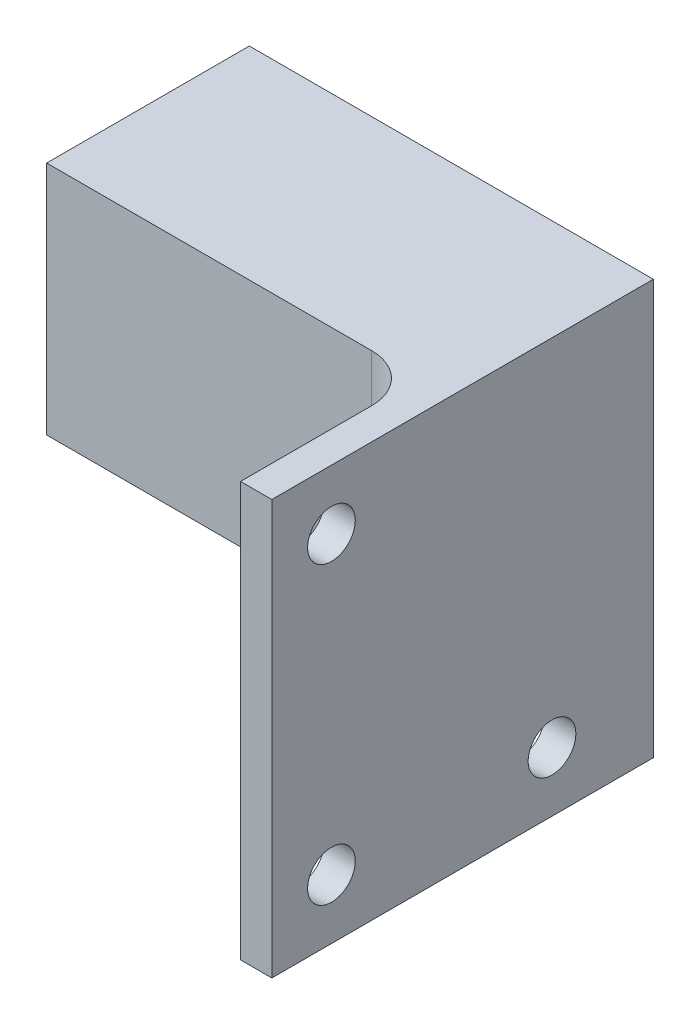
ISO-10303-21;
HEADER;
FILE_DESCRIPTION(('STEP AP214'),'2;1');
FILE_NAME('part.step','',(''),(''),'','','');
FILE_SCHEMA(('AUTOMOTIVE_DESIGN { 1 0 10303 214 1 1 1 1 }'));
ENDSEC;
DATA;
#1=APPLICATION_CONTEXT('core data for automotive mechanical design processes');
#2=APPLICATION_PROTOCOL_DEFINITION('international standard','automotive_design',2000,#1);
#3=PRODUCT_CONTEXT('',#1,'mechanical');
#4=PRODUCT('Part','Part','',(#3));
#5=PRODUCT_RELATED_PRODUCT_CATEGORY('part','',(#4));
#6=PRODUCT_DEFINITION_FORMATION('','',#4);
#7=PRODUCT_DEFINITION_CONTEXT('part definition',#1,'design');
#8=PRODUCT_DEFINITION('design','',#6,#7);
#9=PRODUCT_DEFINITION_SHAPE('','',#8);
#10=(LENGTH_UNIT() NAMED_UNIT(*) SI_UNIT(.MILLI.,.METRE.));
#11=(NAMED_UNIT(*) PLANE_ANGLE_UNIT() SI_UNIT($,.RADIAN.));
#12=(NAMED_UNIT(*) SI_UNIT($,.STERADIAN.) SOLID_ANGLE_UNIT());
#13=UNCERTAINTY_MEASURE_WITH_UNIT(LENGTH_MEASURE(1.E-05),#10,'distance_accuracy_value','');
#14=(GEOMETRIC_REPRESENTATION_CONTEXT(3) GLOBAL_UNCERTAINTY_ASSIGNED_CONTEXT((#13)) GLOBAL_UNIT_ASSIGNED_CONTEXT((#10,
#11,#12)) REPRESENTATION_CONTEXT('',''));
#15=CARTESIAN_POINT('',(0.,0.,0.));
#16=DIRECTION('',(0.,0.,1.));
#17=DIRECTION('',(1.,0.,0.));
#18=AXIS2_PLACEMENT_3D('',#15,#16,#17);
#19=CARTESIAN_POINT('',(0.,0.,0.));
#20=DIRECTION('',(0.,0.,1.));
#21=DIRECTION('',(1.,0.,0.));
#22=AXIS2_PLACEMENT_3D('',#19,#20,#21);
#23=PLANE('',#22);
#24=DIRECTION('',(0.707106781186549,0.707106781186546,0.));
#25=VECTOR('',#24,1.);
#26=CARTESIAN_POINT('',(14.3189123190276,-14.3189123190276,0.));
#27=LINE('',#26,#25);
#28=CARTESIAN_POINT('',(12.8339880785358,-15.8038365595194,0.));
#29=VERTEX_POINT('',#28);
#30=CARTESIAN_POINT('',(14.3189123190276,-14.3189123190276,0.));
#31=VERTEX_POINT('',#30);
#32=EDGE_CURVE('E230',#29,#31,#27,.T.);
#33=ORIENTED_EDGE('',*,*,#32,.T.);
#34=DIRECTION('',(-0.707106781186546,0.707106781186549,0.));
#35=VECTOR('',#34,1.);
#36=CARTESIAN_POINT('',(0.,0.,0.));
#37=LINE('',#36,#35);
#38=CARTESIAN_POINT('',(0.,0.,0.));
#39=VERTEX_POINT('',#38);
#40=EDGE_CURVE('E197',#31,#39,#37,.T.);
#41=ORIENTED_EDGE('',*,*,#40,.T.);
#42=DIRECTION('',(-0.707106781186549,-0.707106781186546,0.));
#43=VECTOR('',#42,1.);
#44=CARTESIAN_POINT('',(-14.3189123190276,-14.3189123190276,0.));
#45=LINE('',#44,#43);
#46=CARTESIAN_POINT('',(-14.3189123190276,-14.3189123190276,0.));
#47=VERTEX_POINT('',#46);
#48=EDGE_CURVE('E192',#39,#47,#45,.T.);
#49=ORIENTED_EDGE('',*,*,#48,.T.);
#50=DIRECTION('',(0.707106781186546,-0.707106781186549,0.));
#51=VECTOR('',#50,1.);
#52=CARTESIAN_POINT('',(-12.8339880785358,-15.8038365595193,0.));
#53=LINE('',#52,#51);
#54=CARTESIAN_POINT('',(-12.8339880785358,-15.8038365595193,0.));
#55=VERTEX_POINT('',#54);
#56=EDGE_CURVE('E218',#47,#55,#53,.T.);
#57=ORIENTED_EDGE('',*,*,#56,.T.);
#58=DIRECTION('',(0.707106781186548,0.707106781186547,0.));
#59=VECTOR('',#58,1.);
#60=CARTESIAN_POINT('',(-1.06066017177983,-4.03050865276332,0.));
#61=LINE('',#60,#59);
#62=CARTESIAN_POINT('',(-1.06066017177983,-4.03050865276332,0.));
#63=VERTEX_POINT('',#62);
#64=EDGE_CURVE('E221',#55,#63,#61,.T.);
#65=ORIENTED_EDGE('',*,*,#64,.T.);
#66=CARTESIAN_POINT('',(0.,-5.09116882454314,0.));
#67=DIRECTION('',(0.,0.,-1.));
#68=DIRECTION('',(1.,0.,0.));
#69=AXIS2_PLACEMENT_3D('',#66,#67,#68);
#70=CIRCLE('',#69,1.5);
#71=CARTESIAN_POINT('',(1.06066017177983,-4.03050865276332,0.));
#72=VERTEX_POINT('',#71);
#73=EDGE_CURVE('E224',#63,#72,#70,.T.);
#74=ORIENTED_EDGE('',*,*,#73,.T.);
#75=DIRECTION('',(0.707106781186546,-0.707106781186549,0.));
#76=VECTOR('',#75,1.);
#77=CARTESIAN_POINT('',(12.8339880785358,-15.8038365595194,0.));
#78=LINE('',#77,#76);
#79=EDGE_CURVE('E227',#72,#29,#78,.T.);
#80=ORIENTED_EDGE('',*,*,#79,.T.);
#81=EDGE_LOOP('',(#33,#41,#49,#57,#65,#74,#80));
#82=FACE_BOUND('',#81,.T.);
#83=DIRECTION('',(0.,-1.,0.));
#84=VECTOR('',#83,1.);
#85=CARTESIAN_POINT('',(-16.9436633033699,2.29341479592354,0.));
#86=LINE('',#85,#84);
#87=CARTESIAN_POINT('',(-16.9436633033699,2.29341479592354,0.));
#88=VERTEX_POINT('',#87);
#89=CARTESIAN_POINT('',(-16.9436633033699,-17.4666720005029,0.));
#90=VERTEX_POINT('',#89);
#91=EDGE_CURVE('E255',#88,#90,#86,.T.);
#92=ORIENTED_EDGE('',*,*,#91,.F.);
#93=DIRECTION('',(-1.,0.,0.));
#94=VECTOR('',#93,1.);
#95=CARTESIAN_POINT('',(-16.9436633033699,2.29341479592354,0.));
#96=LINE('',#95,#94);
#97=CARTESIAN_POINT('',(16.9436633033699,2.29341479592354,0.));
#98=VERTEX_POINT('',#97);
#99=EDGE_CURVE('E253',#98,#88,#96,.T.);
#100=ORIENTED_EDGE('',*,*,#99,.F.);
#101=DIRECTION('',(0.,1.,0.));
#102=VECTOR('',#101,1.);
#103=CARTESIAN_POINT('',(16.9436633033699,2.29341479592354,0.));
#104=LINE('',#103,#102);
#105=CARTESIAN_POINT('',(16.9436633033699,-32.4666720005029,0.));
#106=VERTEX_POINT('',#105);
#107=EDGE_CURVE('E250',#106,#98,#104,.T.);
#108=ORIENTED_EDGE('',*,*,#107,.F.);
#109=DIRECTION('',(1.,0.,0.));
#110=VECTOR('',#109,1.);
#111=CARTESIAN_POINT('',(14.3189123190276,-32.4666720005029,0.));
#112=LINE('',#111,#110);
#113=CARTESIAN_POINT('',(14.3189123190276,-32.4666720005029,0.));
#114=VERTEX_POINT('',#113);
#115=EDGE_CURVE('E181',#114,#106,#112,.T.);
#116=ORIENTED_EDGE('',*,*,#115,.F.);
#117=DIRECTION('',(0.,1.,0.));
#118=VECTOR('',#117,1.);
#119=CARTESIAN_POINT('',(14.3189123190276,2.29341479592354,0.));
#120=LINE('',#119,#118);
#121=CARTESIAN_POINT('',(14.3189123190276,-21.4666720005029,0.));
#122=VERTEX_POINT('',#121);
#123=EDGE_CURVE('E158',#114,#122,#120,.T.);
#124=ORIENTED_EDGE('',*,*,#123,.T.);
#125=CARTESIAN_POINT('',(10.3189123190276,-21.4666720005029,0.));
#126=DIRECTION('',(0.,0.,1.));
#127=DIRECTION('',(1.,0.,0.));
#128=AXIS2_PLACEMENT_3D('',#125,#126,#127);
#129=CIRCLE('',#128,4.);
#130=CARTESIAN_POINT('',(10.3189123190276,-17.4666720005029,0.));
#131=VERTEX_POINT('',#130);
#132=EDGE_CURVE('E11',#122,#131,#129,.T.);
#133=ORIENTED_EDGE('',*,*,#132,.T.);
#134=DIRECTION('',(1.,0.,0.));
#135=VECTOR('',#134,1.);
#136=CARTESIAN_POINT('',(-16.9436633033699,-17.4666720005029,0.));
#137=LINE('',#136,#135);
#138=EDGE_CURVE('E257',#90,#131,#137,.T.);
#139=ORIENTED_EDGE('',*,*,#138,.F.);
#140=EDGE_LOOP('',(#92,#100,#108,#116,#124,#133,#139));
#141=FACE_BOUND('',#140,.T.);
#142=ADVANCED_FACE('F33',(#82,#141),#23,.F.);
#143=CARTESIAN_POINT('',(16.9436633033699,2.29341479592354,15.));
#144=DIRECTION('',(-1.,0.,0.));
#145=DIRECTION('',(0.,0.,1.));
#146=AXIS2_PLACEMENT_3D('',#143,#144,#145);
#147=PLANE('',#146);
#148=DIRECTION('',(0.,0.,-1.));
#149=VECTOR('',#148,1.);
#150=CARTESIAN_POINT('',(16.9436633033699,-32.4666720005029,0.));
#151=LINE('',#150,#149);
#152=CARTESIAN_POINT('',(16.9436633033699,-32.4666720005029,32.));
#153=VERTEX_POINT('',#152);
#154=EDGE_CURVE('E177',#153,#106,#151,.T.);
#155=ORIENTED_EDGE('',*,*,#154,.T.);
#156=ORIENTED_EDGE('',*,*,#107,.T.);
#157=DIRECTION('',(0.,0.,-1.));
#158=VECTOR('',#157,1.);
#159=CARTESIAN_POINT('',(16.9436633033699,2.29341479592354,15.));
#160=LINE('',#159,#158);
#161=CARTESIAN_POINT('',(16.9436633033699,2.29341479592354,32.));
#162=VERTEX_POINT('',#161);
#163=EDGE_CURVE('E265',#162,#98,#160,.T.);
#164=ORIENTED_EDGE('',*,*,#163,.F.);
#165=DIRECTION('',(0.,-1.,0.));
#166=VECTOR('',#165,1.);
#167=CARTESIAN_POINT('',(16.9436633033699,2.29341479592354,32.));
#168=LINE('',#167,#166);
#169=EDGE_CURVE('E165',#162,#153,#168,.T.);
#170=ORIENTED_EDGE('',*,*,#169,.T.);
#171=EDGE_LOOP('',(#155,#156,#164,#170));
#172=FACE_BOUND('',#171,.T.);
#173=CARTESIAN_POINT('',(16.9436633033699,-2.70658520407646,27.));
#174=DIRECTION('',(1.,0.,0.));
#175=DIRECTION('',(0.,0.,-1.));
#176=AXIS2_PLACEMENT_3D('',#173,#174,#175);
#177=CIRCLE('',#176,2.);
#178=CARTESIAN_POINT('',(16.9436633033699,-2.70658520407646,25.));
#179=VERTEX_POINT('',#178);
#180=EDGE_CURVE('E285',#179,#179,#177,.T.);
#181=ORIENTED_EDGE('',*,*,#180,.F.);
#182=EDGE_LOOP('',(#181));
#183=FACE_BOUND('',#182,.T.);
#184=CARTESIAN_POINT('',(16.9436633033699,-27.4666720005029,27.));
#185=DIRECTION('',(1.,0.,0.));
#186=DIRECTION('',(0.,0.,-1.));
#187=AXIS2_PLACEMENT_3D('',#184,#185,#186);
#188=CIRCLE('',#187,2.);
#189=CARTESIAN_POINT('',(16.9436633033699,-27.4666720005029,25.));
#190=VERTEX_POINT('',#189);
#191=EDGE_CURVE('E292',#190,#190,#188,.T.);
#192=ORIENTED_EDGE('',*,*,#191,.F.);
#193=EDGE_LOOP('',(#192));
#194=FACE_BOUND('',#193,.T.);
#195=CARTESIAN_POINT('',(16.9436633033699,-27.4666720005029,8.5));
#196=DIRECTION('',(1.,0.,0.));
#197=DIRECTION('',(0.,0.,-1.));
#198=AXIS2_PLACEMENT_3D('',#195,#196,#197);
#199=CIRCLE('',#198,2.);
#200=CARTESIAN_POINT('',(16.9436633033699,-27.4666720005029,6.5));
#201=VERTEX_POINT('',#200);
#202=EDGE_CURVE('E298',#201,#201,#199,.T.);
#203=ORIENTED_EDGE('',*,*,#202,.F.);
#204=EDGE_LOOP('',(#203));
#205=FACE_BOUND('',#204,.T.);
#206=ADVANCED_FACE('F308',(#172,#183,#194,#205),#147,.F.);
#207=CARTESIAN_POINT('',(-16.9436633033699,2.29341479592354,15.));
#208=DIRECTION('',(0.,-1.,0.));
#209=DIRECTION('',(0.,0.,-1.));
#210=AXIS2_PLACEMENT_3D('',#207,#208,#209);
#211=PLANE('',#210);
#212=DIRECTION('',(-1.,0.,0.));
#213=VECTOR('',#212,1.);
#214=CARTESIAN_POINT('',(16.9436633033699,2.29341479592354,17.));
#215=LINE('',#214,#213);
#216=CARTESIAN_POINT('',(10.3189123190276,2.29341479592354,17.));
#217=VERTEX_POINT('',#216);
#218=CARTESIAN_POINT('',(-16.9436633033699,2.29341479592354,17.));
#219=VERTEX_POINT('',#218);
#220=EDGE_CURVE('E187',#217,#219,#215,.T.);
#221=ORIENTED_EDGE('',*,*,#220,.F.);
#222=CARTESIAN_POINT('',(10.3189123190276,2.29341479592354,21.));
#223=DIRECTION('',(0.,-1.,0.));
#224=DIRECTION('',(0.,0.,-1.));
#225=AXIS2_PLACEMENT_3D('',#222,#223,#224);
#226=CIRCLE('',#225,4.);
#227=CARTESIAN_POINT('',(14.3189123190276,2.29341479592354,21.));
#228=VERTEX_POINT('',#227);
#229=EDGE_CURVE('E42',#217,#228,#226,.T.);
#230=ORIENTED_EDGE('',*,*,#229,.T.);
#231=DIRECTION('',(0.,0.,1.));
#232=VECTOR('',#231,1.);
#233=CARTESIAN_POINT('',(14.3189123190276,2.29341479592354,0.));
#234=LINE('',#233,#232);
#235=CARTESIAN_POINT('',(14.3189123190276,2.29341479592354,32.));
#236=VERTEX_POINT('',#235);
#237=EDGE_CURVE('E145',#228,#236,#234,.T.);
#238=ORIENTED_EDGE('',*,*,#237,.T.);
#239=DIRECTION('',(1.,0.,0.));
#240=VECTOR('',#239,1.);
#241=CARTESIAN_POINT('',(14.3189123190276,2.29341479592354,32.));
#242=LINE('',#241,#240);
#243=EDGE_CURVE('E150',#236,#162,#242,.T.);
#244=ORIENTED_EDGE('',*,*,#243,.T.);
#245=ORIENTED_EDGE('',*,*,#163,.T.);
#246=ORIENTED_EDGE('',*,*,#99,.T.);
#247=DIRECTION('',(0.,0.,-1.));
#248=VECTOR('',#247,1.);
#249=CARTESIAN_POINT('',(-16.9436633033699,2.29341479592354,15.));
#250=LINE('',#249,#248);
#251=EDGE_CURVE('E262',#219,#88,#250,.T.);
#252=ORIENTED_EDGE('',*,*,#251,.F.);
#253=EDGE_LOOP('',(#221,#230,#238,#244,#245,#246,#252));
#254=FACE_BOUND('',#253,.T.);
#255=ADVANCED_FACE('F148',(#254),#211,.F.);
#256=CARTESIAN_POINT('',(-16.9436633033699,2.29341479592354,15.));
#257=DIRECTION('',(1.,0.,0.));
#258=DIRECTION('',(0.,0.,-1.));
#259=AXIS2_PLACEMENT_3D('',#256,#257,#258);
#260=PLANE('',#259);
#261=ORIENTED_EDGE('',*,*,#91,.T.);
#262=DIRECTION('',(0.,0.,-1.));
#263=VECTOR('',#262,1.);
#264=CARTESIAN_POINT('',(-16.9436633033699,-17.4666720005029,15.));
#265=LINE('',#264,#263);
#266=CARTESIAN_POINT('',(-16.9436633033699,-17.4666720005029,17.));
#267=VERTEX_POINT('',#266);
#268=EDGE_CURVE('E259',#267,#90,#265,.T.);
#269=ORIENTED_EDGE('',*,*,#268,.F.);
#270=DIRECTION('',(0.,-1.,0.));
#271=VECTOR('',#270,1.);
#272=CARTESIAN_POINT('',(-16.9436633033699,2.29341479592354,17.));
#273=LINE('',#272,#271);
#274=EDGE_CURVE('E189',#219,#267,#273,.T.);
#275=ORIENTED_EDGE('',*,*,#274,.F.);
#276=ORIENTED_EDGE('',*,*,#251,.T.);
#277=EDGE_LOOP('',(#261,#269,#275,#276));
#278=FACE_BOUND('',#277,.T.);
#279=ADVANCED_FACE('F316',(#278),#260,.F.);
#280=CARTESIAN_POINT('',(-16.9436633033699,-17.4666720005029,15.));
#281=DIRECTION('',(0.,1.,0.));
#282=DIRECTION('',(0.,0.,1.));
#283=AXIS2_PLACEMENT_3D('',#280,#281,#282);
#284=PLANE('',#283);
#285=ORIENTED_EDGE('',*,*,#138,.T.);
#286=DIRECTION('',(0.,0.,1.));
#287=VECTOR('',#286,1.);
#288=CARTESIAN_POINT('',(10.3189123190276,-17.4666720005029,15.));
#289=LINE('',#288,#287);
#290=CARTESIAN_POINT('',(10.3189123190276,-17.4666720005029,17.));
#291=VERTEX_POINT('',#290);
#292=EDGE_CURVE('E54',#131,#291,#289,.T.);
#293=ORIENTED_EDGE('',*,*,#292,.T.);
#294=DIRECTION('',(1.,0.,0.));
#295=VECTOR('',#294,1.);
#296=CARTESIAN_POINT('',(-16.9436633033699,-17.4666720005029,17.));
#297=LINE('',#296,#295);
#298=EDGE_CURVE('E184',#267,#291,#297,.T.);
#299=ORIENTED_EDGE('',*,*,#298,.F.);
#300=ORIENTED_EDGE('',*,*,#268,.T.);
#301=EDGE_LOOP('',(#285,#293,#299,#300));
#302=FACE_BOUND('',#301,.T.);
#303=ADVANCED_FACE('F384',(#302),#284,.F.);
#304=CARTESIAN_POINT('',(-14.3189123190276,-14.3189123190276,15.));
#305=DIRECTION('',(0.707106781186546,-0.707106781186549,0.));
#306=DIRECTION('',(0.707106781186549,0.707106781186546,0.));
#307=AXIS2_PLACEMENT_3D('',#304,#305,#306);
#308=PLANE('',#307);
#309=ORIENTED_EDGE('',*,*,#48,.F.);
#310=DIRECTION('',(0.,0.,-1.));
#311=VECTOR('',#310,1.);
#312=CARTESIAN_POINT('',(0.,0.,15.));
#313=LINE('',#312,#311);
#314=CARTESIAN_POINT('',(0.,0.,15.));
#315=VERTEX_POINT('',#314);
#316=EDGE_CURVE('E215',#315,#39,#313,.T.);
#317=ORIENTED_EDGE('',*,*,#316,.F.);
#318=DIRECTION('',(-0.707106781186549,-0.707106781186546,0.));
#319=VECTOR('',#318,1.);
#320=CARTESIAN_POINT('',(-14.3189123190276,-14.3189123190276,15.));
#321=LINE('',#320,#319);
#322=CARTESIAN_POINT('',(-14.3189123190276,-14.3189123190276,15.));
#323=VERTEX_POINT('',#322);
#324=EDGE_CURVE('E193',#315,#323,#321,.T.);
#325=ORIENTED_EDGE('',*,*,#324,.T.);
#326=DIRECTION('',(0.,0.,-1.));
#327=VECTOR('',#326,1.);
#328=CARTESIAN_POINT('',(-14.3189123190276,-14.3189123190276,15.));
#329=LINE('',#328,#327);
#330=EDGE_CURVE('E247',#323,#47,#329,.T.);
#331=ORIENTED_EDGE('',*,*,#330,.T.);
#332=EDGE_LOOP('',(#309,#317,#325,#331));
#333=FACE_BOUND('',#332,.T.);
#334=ADVANCED_FACE('F381',(#333),#308,.T.);
#335=CARTESIAN_POINT('',(-12.8339880785358,-15.8038365595193,15.));
#336=DIRECTION('',(0.707106781186549,0.707106781186546,0.));
#337=DIRECTION('',(-0.707106781186546,0.707106781186549,0.));
#338=AXIS2_PLACEMENT_3D('',#335,#336,#337);
#339=PLANE('',#338);
#340=ORIENTED_EDGE('',*,*,#56,.F.);
#341=ORIENTED_EDGE('',*,*,#330,.F.);
#342=DIRECTION('',(0.707106781186546,-0.707106781186549,0.));
#343=VECTOR('',#342,1.);
#344=CARTESIAN_POINT('',(-12.8339880785358,-15.8038365595193,15.));
#345=LINE('',#344,#343);
#346=CARTESIAN_POINT('',(-12.8339880785358,-15.8038365595193,15.));
#347=VERTEX_POINT('',#346);
#348=EDGE_CURVE('E196',#323,#347,#345,.T.);
#349=ORIENTED_EDGE('',*,*,#348,.T.);
#350=DIRECTION('',(0.,0.,-1.));
#351=VECTOR('',#350,1.);
#352=CARTESIAN_POINT('',(-12.8339880785358,-15.8038365595193,15.));
#353=LINE('',#352,#351);
#354=EDGE_CURVE('E245',#347,#55,#353,.T.);
#355=ORIENTED_EDGE('',*,*,#354,.T.);
#356=EDGE_LOOP('',(#340,#341,#349,#355));
#357=FACE_BOUND('',#356,.T.);
#358=ADVANCED_FACE('F377',(#357),#339,.T.);
#359=CARTESIAN_POINT('',(-1.06066017177983,-4.03050865276332,15.));
#360=DIRECTION('',(-0.707106781186547,0.707106781186549,0.));
#361=DIRECTION('',(-0.707106781186549,-0.707106781186547,0.));
#362=AXIS2_PLACEMENT_3D('',#359,#360,#361);
#363=PLANE('',#362);
#364=ORIENTED_EDGE('',*,*,#64,.F.);
#365=ORIENTED_EDGE('',*,*,#354,.F.);
#366=DIRECTION('',(0.707106781186548,0.707106781186547,0.));
#367=VECTOR('',#366,1.);
#368=CARTESIAN_POINT('',(-1.06066017177983,-4.03050865276332,15.));
#369=LINE('',#368,#367);
#370=CARTESIAN_POINT('',(-1.06066017177983,-4.03050865276332,15.));
#371=VERTEX_POINT('',#370);
#372=EDGE_CURVE('E200',#347,#371,#369,.T.);
#373=ORIENTED_EDGE('',*,*,#372,.T.);
#374=DIRECTION('',(0.,0.,-1.));
#375=VECTOR('',#374,1.);
#376=CARTESIAN_POINT('',(-1.06066017177983,-4.03050865276332,15.));
#377=LINE('',#376,#375);
#378=EDGE_CURVE('E243',#371,#63,#377,.T.);
#379=ORIENTED_EDGE('',*,*,#378,.T.);
#380=EDGE_LOOP('',(#364,#365,#373,#379));
#381=FACE_BOUND('',#380,.T.);
#382=ADVANCED_FACE('F373',(#381),#363,.T.);
#383=CARTESIAN_POINT('',(0.,-5.09116882454314,15.));
#384=DIRECTION('',(0.,0.,-1.));
#385=DIRECTION('',(-1.,0.,0.));
#386=AXIS2_PLACEMENT_3D('',#383,#384,#385);
#387=CYLINDRICAL_SURFACE('',#386,1.5);
#388=ORIENTED_EDGE('',*,*,#73,.F.);
#389=ORIENTED_EDGE('',*,*,#378,.F.);
#390=CARTESIAN_POINT('',(0.,-5.09116882454314,15.));
#391=DIRECTION('',(0.,0.,-1.));
#392=DIRECTION('',(1.,0.,0.));
#393=AXIS2_PLACEMENT_3D('',#390,#391,#392);
#394=CIRCLE('',#393,1.5);
#395=CARTESIAN_POINT('',(1.06066017177983,-4.03050865276332,15.));
#396=VERTEX_POINT('',#395);
#397=EDGE_CURVE('E203',#371,#396,#394,.T.);
#398=ORIENTED_EDGE('',*,*,#397,.T.);
#399=DIRECTION('',(0.,0.,-1.));
#400=VECTOR('',#399,1.);
#401=CARTESIAN_POINT('',(1.06066017177983,-4.03050865276332,15.));
#402=LINE('',#401,#400);
#403=EDGE_CURVE('E241',#396,#72,#402,.T.);
#404=ORIENTED_EDGE('',*,*,#403,.T.);
#405=EDGE_LOOP('',(#388,#389,#398,#404));
#406=FACE_BOUND('',#405,.T.);
#407=ADVANCED_FACE('F369',(#406),#387,.T.);
#408=CARTESIAN_POINT('',(12.8339880785358,-15.8038365595194,15.));
#409=DIRECTION('',(0.707106781186549,0.707106781186546,0.));
#410=DIRECTION('',(-0.707106781186546,0.707106781186549,0.));
#411=AXIS2_PLACEMENT_3D('',#408,#409,#410);
#412=PLANE('',#411);
#413=ORIENTED_EDGE('',*,*,#79,.F.);
#414=ORIENTED_EDGE('',*,*,#403,.F.);
#415=DIRECTION('',(0.707106781186546,-0.707106781186549,0.));
#416=VECTOR('',#415,1.);
#417=CARTESIAN_POINT('',(12.8339880785358,-15.8038365595194,15.));
#418=LINE('',#417,#416);
#419=CARTESIAN_POINT('',(12.8339880785358,-15.8038365595194,15.));
#420=VERTEX_POINT('',#419);
#421=EDGE_CURVE('E206',#396,#420,#418,.T.);
#422=ORIENTED_EDGE('',*,*,#421,.T.);
#423=DIRECTION('',(0.,0.,-1.));
#424=VECTOR('',#423,1.);
#425=CARTESIAN_POINT('',(12.8339880785358,-15.8038365595194,15.));
#426=LINE('',#425,#424);
#427=EDGE_CURVE('E239',#420,#29,#426,.T.);
#428=ORIENTED_EDGE('',*,*,#427,.T.);
#429=EDGE_LOOP('',(#413,#414,#422,#428));
#430=FACE_BOUND('',#429,.T.);
#431=ADVANCED_FACE('F365',(#430),#412,.T.);
#432=CARTESIAN_POINT('',(14.3189123190276,-14.3189123190276,15.));
#433=DIRECTION('',(-0.707106781186546,0.707106781186549,0.));
#434=DIRECTION('',(-0.707106781186549,-0.707106781186546,0.));
#435=AXIS2_PLACEMENT_3D('',#432,#433,#434);
#436=PLANE('',#435);
#437=ORIENTED_EDGE('',*,*,#32,.F.);
#438=ORIENTED_EDGE('',*,*,#427,.F.);
#439=DIRECTION('',(0.707106781186549,0.707106781186546,0.));
#440=VECTOR('',#439,1.);
#441=CARTESIAN_POINT('',(14.3189123190276,-14.3189123190276,15.));
#442=LINE('',#441,#440);
#443=CARTESIAN_POINT('',(14.3189123190276,-14.3189123190276,15.));
#444=VERTEX_POINT('',#443);
#445=EDGE_CURVE('E209',#420,#444,#442,.T.);
#446=ORIENTED_EDGE('',*,*,#445,.T.);
#447=DIRECTION('',(0.,0.,-1.));
#448=VECTOR('',#447,1.);
#449=CARTESIAN_POINT('',(14.3189123190276,-14.3189123190276,15.));
#450=LINE('',#449,#448);
#451=EDGE_CURVE('E237',#444,#31,#450,.T.);
#452=ORIENTED_EDGE('',*,*,#451,.T.);
#453=EDGE_LOOP('',(#437,#438,#446,#452));
#454=FACE_BOUND('',#453,.T.);
#455=ADVANCED_FACE('F361',(#454),#436,.T.);
#456=CARTESIAN_POINT('',(0.,0.,15.));
#457=DIRECTION('',(-0.707106781186549,-0.707106781186546,0.));
#458=DIRECTION('',(0.707106781186546,-0.707106781186549,0.));
#459=AXIS2_PLACEMENT_3D('',#456,#457,#458);
#460=PLANE('',#459);
#461=ORIENTED_EDGE('',*,*,#40,.F.);
#462=ORIENTED_EDGE('',*,*,#451,.F.);
#463=DIRECTION('',(-0.707106781186546,0.707106781186549,0.));
#464=VECTOR('',#463,1.);
#465=CARTESIAN_POINT('',(0.,0.,15.));
#466=LINE('',#465,#464);
#467=EDGE_CURVE('E212',#444,#315,#466,.T.);
#468=ORIENTED_EDGE('',*,*,#467,.T.);
#469=ORIENTED_EDGE('',*,*,#316,.T.);
#470=EDGE_LOOP('',(#461,#462,#468,#469));
#471=FACE_BOUND('',#470,.T.);
#472=ADVANCED_FACE('F357',(#471),#460,.T.);
#473=CARTESIAN_POINT('',(0.,0.,15.));
#474=DIRECTION('',(0.,0.,1.));
#475=DIRECTION('',(1.,0.,0.));
#476=AXIS2_PLACEMENT_3D('',#473,#474,#475);
#477=PLANE('',#476);
#478=ORIENTED_EDGE('',*,*,#348,.F.);
#479=ORIENTED_EDGE('',*,*,#324,.F.);
#480=ORIENTED_EDGE('',*,*,#467,.F.);
#481=ORIENTED_EDGE('',*,*,#445,.F.);
#482=ORIENTED_EDGE('',*,*,#421,.F.);
#483=ORIENTED_EDGE('',*,*,#397,.F.);
#484=ORIENTED_EDGE('',*,*,#372,.F.);
#485=EDGE_LOOP('',(#478,#479,#480,#481,#482,#483,#484));
#486=FACE_BOUND('',#485,.T.);
#487=ADVANCED_FACE('F354',(#486),#477,.F.);
#488=CARTESIAN_POINT('',(0.,0.,17.));
#489=DIRECTION('',(0.,0.,1.));
#490=DIRECTION('',(1.,0.,0.));
#491=AXIS2_PLACEMENT_3D('',#488,#489,#490);
#492=PLANE('',#491);
#493=ORIENTED_EDGE('',*,*,#298,.T.);
#494=DIRECTION('',(0.,-1.,0.));
#495=VECTOR('',#494,1.);
#496=CARTESIAN_POINT('',(10.3189123190276,2.29341479592354,17.));
#497=LINE('',#496,#495);
#498=EDGE_CURVE('E271',#291,#217,#497,.F.);
#499=ORIENTED_EDGE('',*,*,#498,.T.);
#500=ORIENTED_EDGE('',*,*,#220,.T.);
#501=ORIENTED_EDGE('',*,*,#274,.T.);
#502=EDGE_LOOP('',(#493,#499,#500,#501));
#503=FACE_BOUND('',#502,.T.);
#504=ADVANCED_FACE('F276',(#503),#492,.T.);
#505=CARTESIAN_POINT('',(14.3189123190276,0.,0.));
#506=DIRECTION('',(-1.,0.,0.));
#507=DIRECTION('',(0.,0.,1.));
#508=AXIS2_PLACEMENT_3D('',#505,#506,#507);
#509=PLANE('',#508);
#510=CARTESIAN_POINT('',(14.3189123190276,-27.4666720005029,8.5));
#511=DIRECTION('',(1.,0.,0.));
#512=DIRECTION('',(0.,0.,-1.));
#513=AXIS2_PLACEMENT_3D('',#510,#511,#512);
#514=CIRCLE('',#513,2.);
#515=CARTESIAN_POINT('',(14.3189123190276,-27.4666720005029,6.5));
#516=VERTEX_POINT('',#515);
#517=EDGE_CURVE('E178',#516,#516,#514,.T.);
#518=ORIENTED_EDGE('',*,*,#517,.T.);
#519=EDGE_LOOP('',(#518));
#520=FACE_BOUND('',#519,.T.);
#521=CARTESIAN_POINT('',(14.3189123190276,-27.4666720005029,27.));
#522=DIRECTION('',(1.,0.,0.));
#523=DIRECTION('',(0.,0.,-1.));
#524=AXIS2_PLACEMENT_3D('',#521,#522,#523);
#525=CIRCLE('',#524,2.);
#526=CARTESIAN_POINT('',(14.3189123190276,-27.4666720005029,25.));
#527=VERTEX_POINT('',#526);
#528=EDGE_CURVE('E295',#527,#527,#525,.T.);
#529=ORIENTED_EDGE('',*,*,#528,.T.);
#530=EDGE_LOOP('',(#529));
#531=FACE_BOUND('',#530,.T.);
#532=CARTESIAN_POINT('',(14.3189123190276,-2.70658520407646,27.));
#533=DIRECTION('',(1.,0.,0.));
#534=DIRECTION('',(0.,0.,-1.));
#535=AXIS2_PLACEMENT_3D('',#532,#533,#534);
#536=CIRCLE('',#535,2.);
#537=CARTESIAN_POINT('',(14.3189123190276,-2.70658520407646,25.));
#538=VERTEX_POINT('',#537);
#539=EDGE_CURVE('E287',#538,#538,#536,.T.);
#540=ORIENTED_EDGE('',*,*,#539,.T.);
#541=EDGE_LOOP('',(#540));
#542=FACE_BOUND('',#541,.T.);
#543=ORIENTED_EDGE('',*,*,#237,.F.);
#544=DIRECTION('',(0.,-1.,0.));
#545=VECTOR('',#544,1.);
#546=CARTESIAN_POINT('',(14.3189123190276,-17.4666720005029,21.));
#547=LINE('',#546,#545);
#548=CARTESIAN_POINT('',(14.3189123190276,-21.4666720005029,21.));
#549=VERTEX_POINT('',#548);
#550=EDGE_CURVE('E269',#228,#549,#547,.T.);
#551=ORIENTED_EDGE('',*,*,#550,.T.);
#552=DIRECTION('',(0.,0.,1.));
#553=VECTOR('',#552,1.);
#554=CARTESIAN_POINT('',(14.3189123190276,-21.4666720005029,0.));
#555=LINE('',#554,#553);
#556=EDGE_CURVE('E267',#549,#122,#555,.F.);
#557=ORIENTED_EDGE('',*,*,#556,.T.);
#558=ORIENTED_EDGE('',*,*,#123,.F.);
#559=DIRECTION('',(0.,0.,-1.));
#560=VECTOR('',#559,1.);
#561=CARTESIAN_POINT('',(14.3189123190276,-32.4666720005029,0.));
#562=LINE('',#561,#560);
#563=CARTESIAN_POINT('',(14.3189123190276,-32.4666720005029,32.));
#564=VERTEX_POINT('',#563);
#565=EDGE_CURVE('E167',#564,#114,#562,.T.);
#566=ORIENTED_EDGE('',*,*,#565,.F.);
#567=DIRECTION('',(0.,-1.,0.));
#568=VECTOR('',#567,1.);
#569=CARTESIAN_POINT('',(14.3189123190276,2.29341479592354,32.));
#570=LINE('',#569,#568);
#571=EDGE_CURVE('E157',#236,#564,#570,.T.);
#572=ORIENTED_EDGE('',*,*,#571,.F.);
#573=EDGE_LOOP('',(#543,#551,#557,#558,#566,#572));
#574=FACE_BOUND('',#573,.T.);
#575=ADVANCED_FACE('F169',(#520,#531,#542,#574),#509,.T.);
#576=CARTESIAN_POINT('',(14.3189123190276,-32.4666720005029,0.));
#577=DIRECTION('',(0.,-1.,0.));
#578=DIRECTION('',(0.,0.,-1.));
#579=AXIS2_PLACEMENT_3D('',#576,#577,#578);
#580=PLANE('',#579);
#581=ORIENTED_EDGE('',*,*,#154,.F.);
#582=DIRECTION('',(1.,0.,0.));
#583=VECTOR('',#582,1.);
#584=CARTESIAN_POINT('',(14.3189123190276,-32.4666720005029,32.));
#585=LINE('',#584,#583);
#586=EDGE_CURVE('E166',#564,#153,#585,.T.);
#587=ORIENTED_EDGE('',*,*,#586,.F.);
#588=ORIENTED_EDGE('',*,*,#565,.T.);
#589=ORIENTED_EDGE('',*,*,#115,.T.);
#590=EDGE_LOOP('',(#581,#587,#588,#589));
#591=FACE_BOUND('',#590,.T.);
#592=ADVANCED_FACE('F345',(#591),#580,.T.);
#593=CARTESIAN_POINT('',(14.3189123190276,2.29341479592354,32.));
#594=DIRECTION('',(0.,0.,1.));
#595=DIRECTION('',(0.,-1.,0.));
#596=AXIS2_PLACEMENT_3D('',#593,#594,#595);
#597=PLANE('',#596);
#598=ORIENTED_EDGE('',*,*,#169,.F.);
#599=ORIENTED_EDGE('',*,*,#243,.F.);
#600=ORIENTED_EDGE('',*,*,#571,.T.);
#601=ORIENTED_EDGE('',*,*,#586,.T.);
#602=EDGE_LOOP('',(#598,#599,#600,#601));
#603=FACE_BOUND('',#602,.T.);
#604=ADVANCED_FACE('F162',(#603),#597,.T.);
#605=CARTESIAN_POINT('',(14.3189123190276,-27.4666720005029,8.5));
#606=DIRECTION('',(1.,0.,0.));
#607=DIRECTION('',(0.,0.,-1.));
#608=AXIS2_PLACEMENT_3D('',#605,#606,#607);
#609=CYLINDRICAL_SURFACE('',#608,2.);
#610=ORIENTED_EDGE('',*,*,#517,.F.);
#611=EDGE_LOOP('',(#610));
#612=FACE_BOUND('',#611,.T.);
#613=ORIENTED_EDGE('',*,*,#202,.T.);
#614=EDGE_LOOP('',(#613));
#615=FACE_BOUND('',#614,.T.);
#616=ADVANCED_FACE('F306',(#612,#615),#609,.F.);
#617=CARTESIAN_POINT('',(14.3189123190276,-27.4666720005029,27.));
#618=DIRECTION('',(1.,0.,0.));
#619=DIRECTION('',(0.,0.,-1.));
#620=AXIS2_PLACEMENT_3D('',#617,#618,#619);
#621=CYLINDRICAL_SURFACE('',#620,2.);
#622=ORIENTED_EDGE('',*,*,#528,.F.);
#623=EDGE_LOOP('',(#622));
#624=FACE_BOUND('',#623,.T.);
#625=ORIENTED_EDGE('',*,*,#191,.T.);
#626=EDGE_LOOP('',(#625));
#627=FACE_BOUND('',#626,.T.);
#628=ADVANCED_FACE('F330',(#624,#627),#621,.F.);
#629=CARTESIAN_POINT('',(14.3189123190276,-2.70658520407646,27.));
#630=DIRECTION('',(1.,0.,0.));
#631=DIRECTION('',(0.,0.,-1.));
#632=AXIS2_PLACEMENT_3D('',#629,#630,#631);
#633=CYLINDRICAL_SURFACE('',#632,2.);
#634=ORIENTED_EDGE('',*,*,#539,.F.);
#635=EDGE_LOOP('',(#634));
#636=FACE_BOUND('',#635,.T.);
#637=ORIENTED_EDGE('',*,*,#180,.T.);
#638=EDGE_LOOP('',(#637));
#639=FACE_BOUND('',#638,.T.);
#640=ADVANCED_FACE('F326',(#636,#639),#633,.F.);
#641=CARTESIAN_POINT('',(10.3189123190276,-21.4666720005029,15.));
#642=DIRECTION('',(0.,0.,1.));
#643=DIRECTION('',(1.,0.,0.));
#644=AXIS2_PLACEMENT_3D('',#641,#642,#643);
#645=CYLINDRICAL_SURFACE('',#644,4.);
#646=ORIENTED_EDGE('',*,*,#132,.F.);
#647=ORIENTED_EDGE('',*,*,#556,.F.);
#648=CARTESIAN_POINT('',(10.3189123190276,-21.4666720005029,21.));
#649=DIRECTION('',(0.,0.707106781186547,0.707106781186547));
#650=DIRECTION('',(0.,-0.707106781186547,0.707106781186547));
#651=AXIS2_PLACEMENT_3D('',#648,#649,#650);
#652=ELLIPSE('',#651,5.65685424949238,4.);
#653=EDGE_CURVE('E37',#291,#549,#652,.F.);
#654=ORIENTED_EDGE('',*,*,#653,.F.);
#655=ORIENTED_EDGE('',*,*,#292,.F.);
#656=EDGE_LOOP('',(#646,#647,#654,#655));
#657=FACE_BOUND('',#656,.T.);
#658=ADVANCED_FACE('F35',(#657),#645,.F.);
#659=CARTESIAN_POINT('',(10.3189123190276,0.,21.));
#660=DIRECTION('',(0.,1.,0.));
#661=DIRECTION('',(0.,0.,1.));
#662=AXIS2_PLACEMENT_3D('',#659,#660,#661);
#663=CYLINDRICAL_SURFACE('',#662,4.);
#664=ORIENTED_EDGE('',*,*,#229,.F.);
#665=ORIENTED_EDGE('',*,*,#498,.F.);
#666=ORIENTED_EDGE('',*,*,#653,.T.);
#667=ORIENTED_EDGE('',*,*,#550,.F.);
#668=EDGE_LOOP('',(#664,#665,#666,#667));
#669=FACE_BOUND('',#668,.T.);
#670=ADVANCED_FACE('F281',(#669),#663,.F.);
#671=CLOSED_SHELL('',(#142,#206,#255,#279,#303,#334,#358,#382,#407,#431,#455,#472,#487,#504,
#575,#592,#604,#616,#628,#640,#658,#670));
#672=MANIFOLD_SOLID_BREP('B2',#671);
#673=ADVANCED_BREP_SHAPE_REPRESENTATION('',(#18,#672),#14);
#674=SHAPE_DEFINITION_REPRESENTATION(#9,#673);
ENDSEC;
END-ISO-10303-21;
